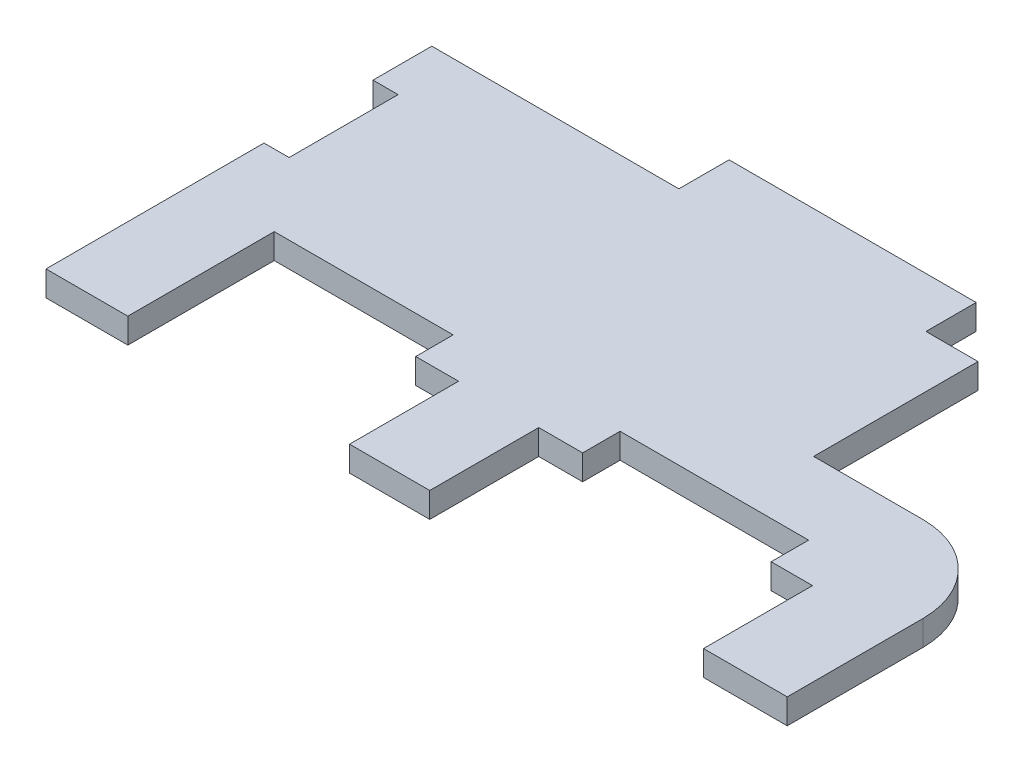
ISO-10303-21;
HEADER;
FILE_DESCRIPTION(('STEP AP214'),'2;1');
FILE_NAME('part.step','',(''),(''),'','','');
FILE_SCHEMA(('AUTOMOTIVE_DESIGN { 1 0 10303 214 1 1 1 1 }'));
ENDSEC;
DATA;
#1=APPLICATION_CONTEXT('core data for automotive mechanical design processes');
#2=APPLICATION_PROTOCOL_DEFINITION('international standard','automotive_design',2000,#1);
#3=PRODUCT_CONTEXT('',#1,'mechanical');
#4=PRODUCT('Part','Part','',(#3));
#5=PRODUCT_RELATED_PRODUCT_CATEGORY('part','',(#4));
#6=PRODUCT_DEFINITION_FORMATION('','',#4);
#7=PRODUCT_DEFINITION_CONTEXT('part definition',#1,'design');
#8=PRODUCT_DEFINITION('design','',#6,#7);
#9=PRODUCT_DEFINITION_SHAPE('','',#8);
#10=(LENGTH_UNIT() NAMED_UNIT(*) SI_UNIT(.MILLI.,.METRE.));
#11=(NAMED_UNIT(*) PLANE_ANGLE_UNIT() SI_UNIT($,.RADIAN.));
#12=(NAMED_UNIT(*) SI_UNIT($,.STERADIAN.) SOLID_ANGLE_UNIT());
#13=UNCERTAINTY_MEASURE_WITH_UNIT(LENGTH_MEASURE(1.E-05),#10,'distance_accuracy_value','');
#14=(GEOMETRIC_REPRESENTATION_CONTEXT(3) GLOBAL_UNCERTAINTY_ASSIGNED_CONTEXT((#13)) GLOBAL_UNIT_ASSIGNED_CONTEXT((#10,
#11,#12)) REPRESENTATION_CONTEXT('',''));
#15=CARTESIAN_POINT('',(0.,0.,0.));
#16=DIRECTION('',(0.,0.,1.));
#17=DIRECTION('',(1.,0.,0.));
#18=AXIS2_PLACEMENT_3D('',#15,#16,#17);
#19=CARTESIAN_POINT('',(-86.36,5.85,-38.1));
#20=DIRECTION('',(0.,0.,1.));
#21=DIRECTION('',(1.,0.,0.));
#22=AXIS2_PLACEMENT_3D('',#19,#20,#21);
#23=PLANE('',#22);
#24=DIRECTION('',(0.,1.,0.));
#25=VECTOR('',#24,1.);
#26=CARTESIAN_POINT('',(-28.7866666666667,5.84999999999999,-38.1));
#27=LINE('',#26,#25);
#28=CARTESIAN_POINT('',(-28.7866666666667,0.,-38.1));
#29=VERTEX_POINT('',#28);
#30=CARTESIAN_POINT('',(-28.7866666666667,5.84999999999999,-38.1));
#31=VERTEX_POINT('',#30);
#32=EDGE_CURVE('E232',#29,#31,#27,.T.);
#33=ORIENTED_EDGE('',*,*,#32,.T.);
#34=DIRECTION('',(-1.,0.,0.));
#35=VECTOR('',#34,1.);
#36=CARTESIAN_POINT('',(-86.36,5.85,-38.1));
#37=LINE('',#36,#35);
#38=CARTESIAN_POINT('',(28.7866666666666,5.84999999999999,-38.1));
#39=VERTEX_POINT('',#38);
#40=EDGE_CURVE('E247',#39,#31,#37,.T.);
#41=ORIENTED_EDGE('',*,*,#40,.F.);
#42=DIRECTION('',(0.,-1.,0.));
#43=VECTOR('',#42,1.);
#44=CARTESIAN_POINT('',(28.7866666666666,5.84999999999999,-38.1));
#45=LINE('',#44,#43);
#46=CARTESIAN_POINT('',(28.7866666666666,0.,-38.1));
#47=VERTEX_POINT('',#46);
#48=EDGE_CURVE('E798',#39,#47,#45,.T.);
#49=ORIENTED_EDGE('',*,*,#48,.T.);
#50=DIRECTION('',(-1.,0.,0.));
#51=VECTOR('',#50,1.);
#52=CARTESIAN_POINT('',(-86.36,0.,-38.1));
#53=LINE('',#52,#51);
#54=EDGE_CURVE('E383',#47,#29,#53,.T.);
#55=ORIENTED_EDGE('',*,*,#54,.T.);
#56=EDGE_LOOP('',(#33,#41,#49,#55));
#57=FACE_BOUND('',#56,.T.);
#58=ADVANCED_FACE('F33',(#57),#23,.F.);
#59=CARTESIAN_POINT('',(86.36,5.85,-38.1));
#60=DIRECTION('',(0.,-1.,0.));
#61=DIRECTION('',(0.,0.,-1.));
#62=AXIS2_PLACEMENT_3D('',#59,#60,#61);
#63=PLANE('',#62);
#64=DIRECTION('',(0.,0.,-1.));
#65=VECTOR('',#64,1.);
#66=CARTESIAN_POINT('',(86.36,5.85,38.1));
#67=LINE('',#66,#65);
#68=CARTESIAN_POINT('',(86.36,5.85,63.5));
#69=VERTEX_POINT('',#68);
#70=CARTESIAN_POINT('',(86.36,5.85,31.9));
#71=VERTEX_POINT('',#70);
#72=EDGE_CURVE('E373',#69,#71,#67,.T.);
#73=ORIENTED_EDGE('',*,*,#72,.T.);
#74=CARTESIAN_POINT('',(66.36,5.85,31.9));
#75=DIRECTION('',(0.,-1.,0.));
#76=DIRECTION('',(0.,0.,-1.));
#77=AXIS2_PLACEMENT_3D('',#74,#75,#76);
#78=CIRCLE('',#77,20.);
#79=CARTESIAN_POINT('',(66.36,5.85,11.9));
#80=VERTEX_POINT('',#79);
#81=EDGE_CURVE('E55',#71,#80,#78,.F.);
#82=ORIENTED_EDGE('',*,*,#81,.T.);
#83=DIRECTION('',(1.,0.,0.));
#84=VECTOR('',#83,1.);
#85=CARTESIAN_POINT('',(86.36,5.85,11.9));
#86=LINE('',#85,#84);
#87=CARTESIAN_POINT('',(40.9168751584446,5.85,11.9));
#88=VERTEX_POINT('',#87);
#89=EDGE_CURVE('E324',#88,#80,#86,.T.);
#90=ORIENTED_EDGE('',*,*,#89,.F.);
#91=DIRECTION('',(0.,0.,1.));
#92=VECTOR('',#91,1.);
#93=CARTESIAN_POINT('',(40.9168751584445,5.85,-38.1));
#94=LINE('',#93,#92);
#95=CARTESIAN_POINT('',(40.9168751584445,5.85,-26.4));
#96=VERTEX_POINT('',#95);
#97=EDGE_CURVE('E320',#96,#88,#94,.T.);
#98=ORIENTED_EDGE('',*,*,#97,.F.);
#99=DIRECTION('',(1.,0.,0.));
#100=VECTOR('',#99,1.);
#101=CARTESIAN_POINT('',(-86.36,5.85,-26.4));
#102=LINE('',#101,#100);
#103=CARTESIAN_POINT('',(28.7866666666666,5.85,-26.4));
#104=VERTEX_POINT('',#103);
#105=EDGE_CURVE('E241',#104,#96,#102,.T.);
#106=ORIENTED_EDGE('',*,*,#105,.F.);
#107=DIRECTION('',(0.,0.,1.));
#108=VECTOR('',#107,1.);
#109=CARTESIAN_POINT('',(28.7866666666666,5.84999999999999,-38.1));
#110=LINE('',#109,#108);
#111=EDGE_CURVE('E249',#39,#104,#110,.T.);
#112=ORIENTED_EDGE('',*,*,#111,.F.);
#113=ORIENTED_EDGE('',*,*,#40,.T.);
#114=DIRECTION('',(0.,0.,-1.));
#115=VECTOR('',#114,1.);
#116=CARTESIAN_POINT('',(-28.7866666666667,5.84999999999999,-38.1));
#117=LINE('',#116,#115);
#118=CARTESIAN_POINT('',(-28.7866666666667,5.85,-26.4));
#119=VERTEX_POINT('',#118);
#120=EDGE_CURVE('E226',#119,#31,#117,.T.);
#121=ORIENTED_EDGE('',*,*,#120,.F.);
#122=CARTESIAN_POINT('',(-86.36,5.85,-26.4));
#123=VERTEX_POINT('',#122);
#124=EDGE_CURVE('E236',#123,#119,#102,.T.);
#125=ORIENTED_EDGE('',*,*,#124,.F.);
#126=DIRECTION('',(0.,0.,1.));
#127=VECTOR('',#126,1.);
#128=CARTESIAN_POINT('',(-86.36,5.85,38.1));
#129=LINE('',#128,#127);
#130=CARTESIAN_POINT('',(-86.36,5.85,-12.7));
#131=VERTEX_POINT('',#130);
#132=EDGE_CURVE('E378',#123,#131,#129,.T.);
#133=ORIENTED_EDGE('',*,*,#132,.T.);
#134=DIRECTION('',(-1.,0.,0.));
#135=VECTOR('',#134,1.);
#136=CARTESIAN_POINT('',(-86.36,5.85,-12.7));
#137=LINE('',#136,#135);
#138=CARTESIAN_POINT('',(-80.51,5.85,-12.7));
#139=VERTEX_POINT('',#138);
#140=EDGE_CURVE('E360',#139,#131,#137,.T.);
#141=ORIENTED_EDGE('',*,*,#140,.F.);
#142=DIRECTION('',(0.,0.,-1.));
#143=VECTOR('',#142,1.);
#144=CARTESIAN_POINT('',(-80.51,5.85,-12.7));
#145=LINE('',#144,#143);
#146=CARTESIAN_POINT('',(-80.51,5.85,12.7));
#147=VERTEX_POINT('',#146);
#148=EDGE_CURVE('E357',#147,#139,#145,.T.);
#149=ORIENTED_EDGE('',*,*,#148,.F.);
#150=DIRECTION('',(1.,0.,0.));
#151=VECTOR('',#150,1.);
#152=CARTESIAN_POINT('',(-86.36,5.85,12.7));
#153=LINE('',#152,#151);
#154=CARTESIAN_POINT('',(-86.36,5.85,12.7));
#155=VERTEX_POINT('',#154);
#156=EDGE_CURVE('E352',#155,#147,#153,.T.);
#157=ORIENTED_EDGE('',*,*,#156,.F.);
#158=CARTESIAN_POINT('',(-86.36,5.85,63.5));
#159=VERTEX_POINT('',#158);
#160=EDGE_CURVE('E377',#155,#159,#129,.T.);
#161=ORIENTED_EDGE('',*,*,#160,.T.);
#162=DIRECTION('',(1.,0.,0.));
#163=VECTOR('',#162,1.);
#164=CARTESIAN_POINT('',(-86.36,5.85,63.5));
#165=LINE('',#164,#163);
#166=CARTESIAN_POINT('',(-67.2933113520948,5.85,63.5));
#167=VERTEX_POINT('',#166);
#168=EDGE_CURVE('E308',#159,#167,#165,.T.);
#169=ORIENTED_EDGE('',*,*,#168,.T.);
#170=DIRECTION('',(0.,0.,1.));
#171=VECTOR('',#170,1.);
#172=CARTESIAN_POINT('',(-67.2933113520948,5.85,38.1));
#173=LINE('',#172,#171);
#174=CARTESIAN_POINT('',(-67.2933113520948,5.85,29.3796161828272));
#175=VERTEX_POINT('',#174);
#176=EDGE_CURVE('E340',#175,#167,#173,.T.);
#177=ORIENTED_EDGE('',*,*,#176,.F.);
#178=DIRECTION('',(-1.,0.,0.));
#179=VECTOR('',#178,1.);
#180=CARTESIAN_POINT('',(-67.2933113520948,5.85,29.3796161828272));
#181=LINE('',#180,#179);
#182=CARTESIAN_POINT('',(-25.6022369593209,5.85,29.3796161828272));
#183=VERTEX_POINT('',#182);
#184=EDGE_CURVE('E346',#183,#175,#181,.T.);
#185=ORIENTED_EDGE('',*,*,#184,.F.);
#186=DIRECTION('',(0.,0.,-1.));
#187=VECTOR('',#186,1.);
#188=CARTESIAN_POINT('',(-25.6022369593209,5.85,38.1));
#189=LINE('',#188,#187);
#190=CARTESIAN_POINT('',(-25.6022369593209,5.85,38.1));
#191=VERTEX_POINT('',#190);
#192=EDGE_CURVE('E344',#191,#183,#189,.T.);
#193=ORIENTED_EDGE('',*,*,#192,.F.);
#194=DIRECTION('',(-1.,0.,0.));
#195=VECTOR('',#194,1.);
#196=CARTESIAN_POINT('',(-25.6022369593209,5.85,38.1));
#197=LINE('',#196,#195);
#198=CARTESIAN_POINT('',(-15.6247389259285,5.85,38.1));
#199=VERTEX_POINT('',#198);
#200=EDGE_CURVE('E286',#199,#191,#197,.T.);
#201=ORIENTED_EDGE('',*,*,#200,.F.);
#202=DIRECTION('',(0.,0.,-1.));
#203=VECTOR('',#202,1.);
#204=CARTESIAN_POINT('',(-15.6247389259285,5.85,38.1));
#205=LINE('',#204,#203);
#206=CARTESIAN_POINT('',(-15.6247389259285,5.85,63.5));
#207=VERTEX_POINT('',#206);
#208=EDGE_CURVE('E283',#207,#199,#205,.T.);
#209=ORIENTED_EDGE('',*,*,#208,.F.);
#210=DIRECTION('',(1.,0.,0.));
#211=VECTOR('',#210,1.);
#212=CARTESIAN_POINT('',(-25.6022369593209,5.85,63.5));
#213=LINE('',#212,#211);
#214=CARTESIAN_POINT('',(3.06081199953049,5.85,63.5));
#215=VERTEX_POINT('',#214);
#216=EDGE_CURVE('E304',#207,#215,#213,.T.);
#217=ORIENTED_EDGE('',*,*,#216,.T.);
#218=DIRECTION('',(0.,0.,1.));
#219=VECTOR('',#218,1.);
#220=CARTESIAN_POINT('',(3.06081199953049,5.85,38.1));
#221=LINE('',#220,#219);
#222=CARTESIAN_POINT('',(3.06081199953049,5.85,38.1));
#223=VERTEX_POINT('',#222);
#224=EDGE_CURVE('E273',#223,#215,#221,.T.);
#225=ORIENTED_EDGE('',*,*,#224,.F.);
#226=DIRECTION('',(-1.,0.,0.));
#227=VECTOR('',#226,1.);
#228=CARTESIAN_POINT('',(13.2907787493742,5.85,38.1));
#229=LINE('',#228,#227);
#230=CARTESIAN_POINT('',(13.2907787493742,5.85,38.1));
#231=VERTEX_POINT('',#230);
#232=EDGE_CURVE('E270',#231,#223,#229,.T.);
#233=ORIENTED_EDGE('',*,*,#232,.F.);
#234=DIRECTION('',(0.,0.,1.));
#235=VECTOR('',#234,1.);
#236=CARTESIAN_POINT('',(13.2907787493742,5.85,38.1));
#237=LINE('',#236,#235);
#238=CARTESIAN_POINT('',(13.2907787493742,5.85,29.3796161828272));
#239=VERTEX_POINT('',#238);
#240=EDGE_CURVE('E329',#239,#231,#237,.T.);
#241=ORIENTED_EDGE('',*,*,#240,.F.);
#242=DIRECTION('',(-1.,0.,0.));
#243=VECTOR('',#242,1.);
#244=CARTESIAN_POINT('',(13.2907787493742,5.85,29.3796161828272));
#245=LINE('',#244,#243);
#246=CARTESIAN_POINT('',(57.2203000894111,5.85,29.3796161828272));
#247=VERTEX_POINT('',#246);
#248=EDGE_CURVE('E334',#247,#239,#245,.T.);
#249=ORIENTED_EDGE('',*,*,#248,.F.);
#250=DIRECTION('',(0.,0.,-1.));
#251=VECTOR('',#250,1.);
#252=CARTESIAN_POINT('',(57.2203000894111,5.85,38.1));
#253=LINE('',#252,#251);
#254=CARTESIAN_POINT('',(57.2203000894111,5.85,38.1));
#255=VERTEX_POINT('',#254);
#256=EDGE_CURVE('E332',#255,#247,#253,.T.);
#257=ORIENTED_EDGE('',*,*,#256,.F.);
#258=DIRECTION('',(-1.,0.,0.));
#259=VECTOR('',#258,1.);
#260=CARTESIAN_POINT('',(57.2203000894111,5.85,38.1));
#261=LINE('',#260,#259);
#262=CARTESIAN_POINT('',(66.858290089925,5.85,38.1));
#263=VERTEX_POINT('',#262);
#264=EDGE_CURVE('E259',#263,#255,#261,.T.);
#265=ORIENTED_EDGE('',*,*,#264,.F.);
#266=DIRECTION('',(0.,0.,-1.));
#267=VECTOR('',#266,1.);
#268=CARTESIAN_POINT('',(66.858290089925,5.85,38.1));
#269=LINE('',#268,#267);
#270=CARTESIAN_POINT('',(66.858290089925,5.85,63.5));
#271=VERTEX_POINT('',#270);
#272=EDGE_CURVE('E256',#271,#263,#269,.T.);
#273=ORIENTED_EDGE('',*,*,#272,.F.);
#274=DIRECTION('',(1.,0.,0.));
#275=VECTOR('',#274,1.);
#276=CARTESIAN_POINT('',(57.2203000894111,5.85,63.5));
#277=LINE('',#276,#275);
#278=EDGE_CURVE('E297',#271,#69,#277,.T.);
#279=ORIENTED_EDGE('',*,*,#278,.T.);
#280=EDGE_LOOP('',(#73,#82,#90,#98,#106,#112,#113,#121,#125,#133,#141,#149,#157,#161,#169,#177,
#185,#193,#201,#209,#217,#225,#233,#241,#249,#257,#265,#273,#279));
#281=FACE_BOUND('',#280,.T.);
#282=ADVANCED_FACE('F244',(#281),#63,.F.);
#283=CARTESIAN_POINT('',(-86.36,5.85,38.1));
#284=DIRECTION('',(1.,0.,0.));
#285=DIRECTION('',(0.,0.,-1.));
#286=AXIS2_PLACEMENT_3D('',#283,#284,#285);
#287=PLANE('',#286);
#288=ORIENTED_EDGE('',*,*,#132,.F.);
#289=DIRECTION('',(0.,1.,0.));
#290=VECTOR('',#289,1.);
#291=CARTESIAN_POINT('',(-86.36,5.85,-26.4));
#292=LINE('',#291,#290);
#293=CARTESIAN_POINT('',(-86.36,0.,-26.4));
#294=VERTEX_POINT('',#293);
#295=EDGE_CURVE('E239',#294,#123,#292,.T.);
#296=ORIENTED_EDGE('',*,*,#295,.F.);
#297=DIRECTION('',(0.,0.,1.));
#298=VECTOR('',#297,1.);
#299=CARTESIAN_POINT('',(-86.36,0.,38.1));
#300=LINE('',#299,#298);
#301=CARTESIAN_POINT('',(-86.36,0.,-12.7));
#302=VERTEX_POINT('',#301);
#303=EDGE_CURVE('E375',#294,#302,#300,.T.);
#304=ORIENTED_EDGE('',*,*,#303,.T.);
#305=DIRECTION('',(0.,1.,0.));
#306=VECTOR('',#305,1.);
#307=CARTESIAN_POINT('',(-86.36,-4.15,-12.7));
#308=LINE('',#307,#306);
#309=EDGE_CURVE('E364',#302,#131,#308,.T.);
#310=ORIENTED_EDGE('',*,*,#309,.T.);
#311=EDGE_LOOP('',(#288,#296,#304,#310));
#312=FACE_BOUND('',#311,.T.);
#313=ADVANCED_FACE('F459',(#312),#287,.F.);
#314=CARTESIAN_POINT('',(86.36,5.85,38.1));
#315=DIRECTION('',(-1.,0.,0.));
#316=DIRECTION('',(0.,0.,1.));
#317=AXIS2_PLACEMENT_3D('',#314,#315,#316);
#318=PLANE('',#317);
#319=DIRECTION('',(0.,0.,-1.));
#320=VECTOR('',#319,1.);
#321=CARTESIAN_POINT('',(86.36,0.,38.1));
#322=LINE('',#321,#320);
#323=CARTESIAN_POINT('',(86.36,0.,63.5));
#324=VERTEX_POINT('',#323);
#325=CARTESIAN_POINT('',(86.36,0.,31.9));
#326=VERTEX_POINT('',#325);
#327=EDGE_CURVE('E367',#324,#326,#322,.T.);
#328=ORIENTED_EDGE('',*,*,#327,.T.);
#329=DIRECTION('',(0.,1.,0.));
#330=VECTOR('',#329,1.);
#331=CARTESIAN_POINT('',(86.36,5.85,31.9));
#332=LINE('',#331,#330);
#333=EDGE_CURVE('E424',#326,#71,#332,.T.);
#334=ORIENTED_EDGE('',*,*,#333,.T.);
#335=ORIENTED_EDGE('',*,*,#72,.F.);
#336=DIRECTION('',(0.,1.,0.));
#337=VECTOR('',#336,1.);
#338=CARTESIAN_POINT('',(86.36,0.,63.5));
#339=LINE('',#338,#337);
#340=EDGE_CURVE('E300',#324,#69,#339,.T.);
#341=ORIENTED_EDGE('',*,*,#340,.F.);
#342=EDGE_LOOP('',(#328,#334,#335,#341));
#343=FACE_BOUND('',#342,.T.);
#344=ADVANCED_FACE('F430',(#343),#318,.F.);
#345=ORIENTED_EDGE('',*,*,#160,.F.);
#346=DIRECTION('',(0.,1.,0.));
#347=VECTOR('',#346,1.);
#348=CARTESIAN_POINT('',(-86.36,-4.15,12.7));
#349=LINE('',#348,#347);
#350=CARTESIAN_POINT('',(-86.36,0.,12.7));
#351=VERTEX_POINT('',#350);
#352=EDGE_CURVE('E363',#351,#155,#349,.T.);
#353=ORIENTED_EDGE('',*,*,#352,.F.);
#354=CARTESIAN_POINT('',(-86.36,0.,63.5));
#355=VERTEX_POINT('',#354);
#356=EDGE_CURVE('E386',#351,#355,#300,.T.);
#357=ORIENTED_EDGE('',*,*,#356,.T.);
#358=DIRECTION('',(0.,1.,0.));
#359=VECTOR('',#358,1.);
#360=CARTESIAN_POINT('',(-86.36,0.,63.5));
#361=LINE('',#360,#359);
#362=EDGE_CURVE('E314',#355,#159,#361,.T.);
#363=ORIENTED_EDGE('',*,*,#362,.T.);
#364=EDGE_LOOP('',(#345,#353,#357,#363));
#365=FACE_BOUND('',#364,.T.);
#366=ADVANCED_FACE('F462',(#365),#287,.F.);
#367=CARTESIAN_POINT('',(86.36,0.,-38.1));
#368=DIRECTION('',(0.,-1.,0.));
#369=DIRECTION('',(0.,0.,-1.));
#370=AXIS2_PLACEMENT_3D('',#367,#368,#369);
#371=PLANE('',#370);
#372=DIRECTION('',(-1.,0.,0.));
#373=VECTOR('',#372,1.);
#374=CARTESIAN_POINT('',(86.36,0.,11.9));
#375=LINE('',#374,#373);
#376=CARTESIAN_POINT('',(66.36,0.,11.9));
#377=VERTEX_POINT('',#376);
#378=CARTESIAN_POINT('',(40.9168751584446,0.,11.9));
#379=VERTEX_POINT('',#378);
#380=EDGE_CURVE('E413',#377,#379,#375,.T.);
#381=ORIENTED_EDGE('',*,*,#380,.F.);
#382=CARTESIAN_POINT('',(66.36,0.,31.9));
#383=DIRECTION('',(0.,-1.,0.));
#384=DIRECTION('',(0.,0.,-1.));
#385=AXIS2_PLACEMENT_3D('',#382,#383,#384);
#386=CIRCLE('',#385,20.);
#387=EDGE_CURVE('E11',#377,#326,#386,.T.);
#388=ORIENTED_EDGE('',*,*,#387,.T.);
#389=ORIENTED_EDGE('',*,*,#327,.F.);
#390=DIRECTION('',(1.,0.,0.));
#391=VECTOR('',#390,1.);
#392=CARTESIAN_POINT('',(57.2203000894111,0.,63.5));
#393=LINE('',#392,#391);
#394=CARTESIAN_POINT('',(66.858290089925,0.,63.5));
#395=VERTEX_POINT('',#394);
#396=EDGE_CURVE('E298',#395,#324,#393,.T.);
#397=ORIENTED_EDGE('',*,*,#396,.F.);
#398=DIRECTION('',(0.,0.,1.));
#399=VECTOR('',#398,1.);
#400=CARTESIAN_POINT('',(66.858290089925,0.,-38.1));
#401=LINE('',#400,#399);
#402=CARTESIAN_POINT('',(66.858290089925,0.,38.1));
#403=VERTEX_POINT('',#402);
#404=EDGE_CURVE('E265',#403,#395,#401,.T.);
#405=ORIENTED_EDGE('',*,*,#404,.F.);
#406=DIRECTION('',(1.,0.,0.));
#407=VECTOR('',#406,1.);
#408=CARTESIAN_POINT('',(86.36,0.,38.1));
#409=LINE('',#408,#407);
#410=CARTESIAN_POINT('',(57.2203000894111,0.,38.1));
#411=VERTEX_POINT('',#410);
#412=EDGE_CURVE('E268',#411,#403,#409,.T.);
#413=ORIENTED_EDGE('',*,*,#412,.F.);
#414=DIRECTION('',(0.,0.,1.));
#415=VECTOR('',#414,1.);
#416=CARTESIAN_POINT('',(57.2203000894111,0.,-38.1));
#417=LINE('',#416,#415);
#418=CARTESIAN_POINT('',(57.2203000894111,0.,29.3796161828272));
#419=VERTEX_POINT('',#418);
#420=EDGE_CURVE('E402',#419,#411,#417,.T.);
#421=ORIENTED_EDGE('',*,*,#420,.F.);
#422=DIRECTION('',(1.,0.,0.));
#423=VECTOR('',#422,1.);
#424=CARTESIAN_POINT('',(86.36,0.,29.3796161828272));
#425=LINE('',#424,#423);
#426=CARTESIAN_POINT('',(13.2907787493742,0.,29.3796161828272));
#427=VERTEX_POINT('',#426);
#428=EDGE_CURVE('E405',#427,#419,#425,.T.);
#429=ORIENTED_EDGE('',*,*,#428,.F.);
#430=DIRECTION('',(0.,0.,-1.));
#431=VECTOR('',#430,1.);
#432=CARTESIAN_POINT('',(13.2907787493742,0.,-38.1));
#433=LINE('',#432,#431);
#434=CARTESIAN_POINT('',(13.2907787493742,0.,38.1));
#435=VERTEX_POINT('',#434);
#436=EDGE_CURVE('E408',#435,#427,#433,.T.);
#437=ORIENTED_EDGE('',*,*,#436,.F.);
#438=DIRECTION('',(1.,0.,0.));
#439=VECTOR('',#438,1.);
#440=CARTESIAN_POINT('',(86.36,0.,38.1));
#441=LINE('',#440,#439);
#442=CARTESIAN_POINT('',(3.06081199953049,0.,38.1));
#443=VERTEX_POINT('',#442);
#444=EDGE_CURVE('E281',#443,#435,#441,.T.);
#445=ORIENTED_EDGE('',*,*,#444,.F.);
#446=DIRECTION('',(0.,0.,-1.));
#447=VECTOR('',#446,1.);
#448=CARTESIAN_POINT('',(3.06081199953047,0.,-38.1));
#449=LINE('',#448,#447);
#450=CARTESIAN_POINT('',(3.06081199953049,0.,63.5));
#451=VERTEX_POINT('',#450);
#452=EDGE_CURVE('E278',#451,#443,#449,.T.);
#453=ORIENTED_EDGE('',*,*,#452,.F.);
#454=DIRECTION('',(1.,0.,0.));
#455=VECTOR('',#454,1.);
#456=CARTESIAN_POINT('',(-25.6022369593209,0.,63.5));
#457=LINE('',#456,#455);
#458=CARTESIAN_POINT('',(-15.6247389259285,0.,63.5));
#459=VERTEX_POINT('',#458);
#460=EDGE_CURVE('E305',#459,#451,#457,.T.);
#461=ORIENTED_EDGE('',*,*,#460,.F.);
#462=DIRECTION('',(0.,0.,1.));
#463=VECTOR('',#462,1.);
#464=CARTESIAN_POINT('',(-15.6247389259285,0.,-38.1));
#465=LINE('',#464,#463);
#466=CARTESIAN_POINT('',(-15.6247389259285,0.,38.1));
#467=VERTEX_POINT('',#466);
#468=EDGE_CURVE('E292',#467,#459,#465,.T.);
#469=ORIENTED_EDGE('',*,*,#468,.F.);
#470=DIRECTION('',(1.,0.,0.));
#471=VECTOR('',#470,1.);
#472=CARTESIAN_POINT('',(86.3600000000001,0.,38.0999999999999));
#473=LINE('',#472,#471);
#474=CARTESIAN_POINT('',(-25.6022369593209,0.,38.1));
#475=VERTEX_POINT('',#474);
#476=EDGE_CURVE('E295',#475,#467,#473,.T.);
#477=ORIENTED_EDGE('',*,*,#476,.F.);
#478=DIRECTION('',(0.,0.,1.));
#479=VECTOR('',#478,1.);
#480=CARTESIAN_POINT('',(-25.6022369593209,0.,-38.1));
#481=LINE('',#480,#479);
#482=CARTESIAN_POINT('',(-25.6022369593209,0.,29.3796161828272));
#483=VERTEX_POINT('',#482);
#484=EDGE_CURVE('E394',#483,#475,#481,.T.);
#485=ORIENTED_EDGE('',*,*,#484,.F.);
#486=DIRECTION('',(1.,0.,0.));
#487=VECTOR('',#486,1.);
#488=CARTESIAN_POINT('',(86.36,0.,29.3796161828272));
#489=LINE('',#488,#487);
#490=CARTESIAN_POINT('',(-67.2933113520948,0.,29.3796161828272));
#491=VERTEX_POINT('',#490);
#492=EDGE_CURVE('E397',#491,#483,#489,.T.);
#493=ORIENTED_EDGE('',*,*,#492,.F.);
#494=DIRECTION('',(0.,0.,-1.));
#495=VECTOR('',#494,1.);
#496=CARTESIAN_POINT('',(-67.2933113520948,0.,-38.1));
#497=LINE('',#496,#495);
#498=CARTESIAN_POINT('',(-67.2933113520948,0.,63.5));
#499=VERTEX_POINT('',#498);
#500=EDGE_CURVE('E400',#499,#491,#497,.T.);
#501=ORIENTED_EDGE('',*,*,#500,.F.);
#502=DIRECTION('',(1.,0.,0.));
#503=VECTOR('',#502,1.);
#504=CARTESIAN_POINT('',(-86.36,0.,63.5));
#505=LINE('',#504,#503);
#506=EDGE_CURVE('E311',#355,#499,#505,.T.);
#507=ORIENTED_EDGE('',*,*,#506,.F.);
#508=ORIENTED_EDGE('',*,*,#356,.F.);
#509=DIRECTION('',(-1.,0.,0.));
#510=VECTOR('',#509,1.);
#511=CARTESIAN_POINT('',(86.36,0.,12.7));
#512=LINE('',#511,#510);
#513=CARTESIAN_POINT('',(-80.51,0.,12.7));
#514=VERTEX_POINT('',#513);
#515=EDGE_CURVE('E380',#514,#351,#512,.T.);
#516=ORIENTED_EDGE('',*,*,#515,.F.);
#517=DIRECTION('',(0.,0.,1.));
#518=VECTOR('',#517,1.);
#519=CARTESIAN_POINT('',(-80.51,0.,-38.1));
#520=LINE('',#519,#518);
#521=CARTESIAN_POINT('',(-80.51,0.,-12.7));
#522=VERTEX_POINT('',#521);
#523=EDGE_CURVE('E389',#522,#514,#520,.T.);
#524=ORIENTED_EDGE('',*,*,#523,.F.);
#525=DIRECTION('',(1.,0.,0.));
#526=VECTOR('',#525,1.);
#527=CARTESIAN_POINT('',(86.36,0.,-12.7));
#528=LINE('',#527,#526);
#529=EDGE_CURVE('E392',#302,#522,#528,.T.);
#530=ORIENTED_EDGE('',*,*,#529,.F.);
#531=ORIENTED_EDGE('',*,*,#303,.F.);
#532=DIRECTION('',(-1.,0.,0.));
#533=VECTOR('',#532,1.);
#534=CARTESIAN_POINT('',(86.36,0.,-26.4));
#535=LINE('',#534,#533);
#536=CARTESIAN_POINT('',(-28.7866666666667,0.,-26.4));
#537=VERTEX_POINT('',#536);
#538=EDGE_CURVE('E251',#537,#294,#535,.T.);
#539=ORIENTED_EDGE('',*,*,#538,.F.);
#540=DIRECTION('',(0.,0.,-1.));
#541=VECTOR('',#540,1.);
#542=CARTESIAN_POINT('',(-28.7866666666667,0.,-28.1));
#543=LINE('',#542,#541);
#544=EDGE_CURVE('E229',#537,#29,#543,.T.);
#545=ORIENTED_EDGE('',*,*,#544,.T.);
#546=ORIENTED_EDGE('',*,*,#54,.F.);
#547=DIRECTION('',(0.,0.,-1.));
#548=VECTOR('',#547,1.);
#549=CARTESIAN_POINT('',(28.7866666666666,0.,-28.1));
#550=LINE('',#549,#548);
#551=CARTESIAN_POINT('',(28.7866666666666,0.,-26.4));
#552=VERTEX_POINT('',#551);
#553=EDGE_CURVE('E796',#552,#47,#550,.T.);
#554=ORIENTED_EDGE('',*,*,#553,.F.);
#555=CARTESIAN_POINT('',(40.9168751584445,0.,-26.4));
#556=VERTEX_POINT('',#555);
#557=EDGE_CURVE('E248',#556,#552,#535,.T.);
#558=ORIENTED_EDGE('',*,*,#557,.F.);
#559=DIRECTION('',(0.,0.,-1.));
#560=VECTOR('',#559,1.);
#561=CARTESIAN_POINT('',(40.9168751584445,0.,-38.1));
#562=LINE('',#561,#560);
#563=EDGE_CURVE('E410',#379,#556,#562,.T.);
#564=ORIENTED_EDGE('',*,*,#563,.F.);
#565=EDGE_LOOP('',(#381,#388,#389,#397,#405,#413,#421,#429,#437,#445,#453,#461,#469,#477,#485,
#493,#501,#507,#508,#516,#524,#530,#531,#539,#545,#546,#554,#558,#564));
#566=FACE_BOUND('',#565,.T.);
#567=ADVANCED_FACE('F444',(#566),#371,.T.);
#568=CARTESIAN_POINT('',(-86.36,-4.15,-12.7));
#569=DIRECTION('',(0.,0.,-1.));
#570=DIRECTION('',(-1.,0.,0.));
#571=AXIS2_PLACEMENT_3D('',#568,#569,#570);
#572=PLANE('',#571);
#573=ORIENTED_EDGE('',*,*,#529,.T.);
#574=DIRECTION('',(0.,1.,0.));
#575=VECTOR('',#574,1.);
#576=CARTESIAN_POINT('',(-80.51,-4.15,-12.7));
#577=LINE('',#576,#575);
#578=EDGE_CURVE('E368',#522,#139,#577,.T.);
#579=ORIENTED_EDGE('',*,*,#578,.T.);
#580=ORIENTED_EDGE('',*,*,#140,.T.);
#581=ORIENTED_EDGE('',*,*,#309,.F.);
#582=EDGE_LOOP('',(#573,#579,#580,#581));
#583=FACE_BOUND('',#582,.T.);
#584=ADVANCED_FACE('F478',(#583),#572,.F.);
#585=CARTESIAN_POINT('',(-80.51,-4.15,-12.7));
#586=DIRECTION('',(1.,0.,0.));
#587=DIRECTION('',(0.,0.,-1.));
#588=AXIS2_PLACEMENT_3D('',#585,#586,#587);
#589=PLANE('',#588);
#590=ORIENTED_EDGE('',*,*,#523,.T.);
#591=DIRECTION('',(0.,1.,0.));
#592=VECTOR('',#591,1.);
#593=CARTESIAN_POINT('',(-80.51,-4.15,12.7));
#594=LINE('',#593,#592);
#595=EDGE_CURVE('E370',#514,#147,#594,.T.);
#596=ORIENTED_EDGE('',*,*,#595,.T.);
#597=ORIENTED_EDGE('',*,*,#148,.T.);
#598=ORIENTED_EDGE('',*,*,#578,.F.);
#599=EDGE_LOOP('',(#590,#596,#597,#598));
#600=FACE_BOUND('',#599,.T.);
#601=ADVANCED_FACE('F483',(#600),#589,.F.);
#602=CARTESIAN_POINT('',(-86.36,-4.15,12.7));
#603=DIRECTION('',(0.,0.,1.));
#604=DIRECTION('',(1.,0.,0.));
#605=AXIS2_PLACEMENT_3D('',#602,#603,#604);
#606=PLANE('',#605);
#607=ORIENTED_EDGE('',*,*,#515,.T.);
#608=ORIENTED_EDGE('',*,*,#352,.T.);
#609=ORIENTED_EDGE('',*,*,#156,.T.);
#610=ORIENTED_EDGE('',*,*,#595,.F.);
#611=EDGE_LOOP('',(#607,#608,#609,#610));
#612=FACE_BOUND('',#611,.T.);
#613=ADVANCED_FACE('F595',(#612),#606,.F.);
#614=CARTESIAN_POINT('',(-67.2933113520948,-4.15,38.1));
#615=DIRECTION('',(-1.,0.,0.));
#616=DIRECTION('',(0.,0.,1.));
#617=AXIS2_PLACEMENT_3D('',#614,#615,#616);
#618=PLANE('',#617);
#619=ORIENTED_EDGE('',*,*,#500,.T.);
#620=DIRECTION('',(0.,1.,0.));
#621=VECTOR('',#620,1.);
#622=CARTESIAN_POINT('',(-67.2933113520948,-4.15,29.3796161828272));
#623=LINE('',#622,#621);
#624=EDGE_CURVE('E350',#491,#175,#623,.T.);
#625=ORIENTED_EDGE('',*,*,#624,.T.);
#626=ORIENTED_EDGE('',*,*,#176,.T.);
#627=DIRECTION('',(0.,1.,0.));
#628=VECTOR('',#627,1.);
#629=CARTESIAN_POINT('',(-67.2933113520948,0.,63.5));
#630=LINE('',#629,#628);
#631=EDGE_CURVE('E317',#499,#167,#630,.T.);
#632=ORIENTED_EDGE('',*,*,#631,.F.);
#633=EDGE_LOOP('',(#619,#625,#626,#632));
#634=FACE_BOUND('',#633,.T.);
#635=ADVANCED_FACE('F499',(#634),#618,.F.);
#636=CARTESIAN_POINT('',(-67.2933113520948,-4.15,29.3796161828272));
#637=DIRECTION('',(0.,0.,-1.));
#638=DIRECTION('',(-1.,0.,0.));
#639=AXIS2_PLACEMENT_3D('',#636,#637,#638);
#640=PLANE('',#639);
#641=ORIENTED_EDGE('',*,*,#492,.T.);
#642=DIRECTION('',(0.,1.,0.));
#643=VECTOR('',#642,1.);
#644=CARTESIAN_POINT('',(-25.6022369593209,-4.15,29.3796161828272));
#645=LINE('',#644,#643);
#646=EDGE_CURVE('E349',#483,#183,#645,.T.);
#647=ORIENTED_EDGE('',*,*,#646,.T.);
#648=ORIENTED_EDGE('',*,*,#184,.T.);
#649=ORIENTED_EDGE('',*,*,#624,.F.);
#650=EDGE_LOOP('',(#641,#647,#648,#649));
#651=FACE_BOUND('',#650,.T.);
#652=ADVANCED_FACE('F503',(#651),#640,.F.);
#653=CARTESIAN_POINT('',(-25.6022369593209,-4.15,38.1));
#654=DIRECTION('',(1.,0.,0.));
#655=DIRECTION('',(0.,0.,-1.));
#656=AXIS2_PLACEMENT_3D('',#653,#654,#655);
#657=PLANE('',#656);
#658=ORIENTED_EDGE('',*,*,#484,.T.);
#659=DIRECTION('',(0.,1.,0.));
#660=VECTOR('',#659,1.);
#661=CARTESIAN_POINT('',(-25.6022369593209,-4.15,38.1));
#662=LINE('',#661,#660);
#663=EDGE_CURVE('E289',#475,#191,#662,.T.);
#664=ORIENTED_EDGE('',*,*,#663,.T.);
#665=ORIENTED_EDGE('',*,*,#192,.T.);
#666=ORIENTED_EDGE('',*,*,#646,.F.);
#667=EDGE_LOOP('',(#658,#664,#665,#666));
#668=FACE_BOUND('',#667,.T.);
#669=ADVANCED_FACE('F506',(#668),#657,.F.);
#670=CARTESIAN_POINT('',(13.2907787493742,-4.15,38.1));
#671=DIRECTION('',(-1.,0.,0.));
#672=DIRECTION('',(0.,0.,1.));
#673=AXIS2_PLACEMENT_3D('',#670,#671,#672);
#674=PLANE('',#673);
#675=ORIENTED_EDGE('',*,*,#240,.T.);
#676=DIRECTION('',(0.,1.,0.));
#677=VECTOR('',#676,1.);
#678=CARTESIAN_POINT('',(13.2907787493742,-4.15,38.1));
#679=LINE('',#678,#677);
#680=EDGE_CURVE('E275',#435,#231,#679,.T.);
#681=ORIENTED_EDGE('',*,*,#680,.F.);
#682=ORIENTED_EDGE('',*,*,#436,.T.);
#683=DIRECTION('',(0.,1.,0.));
#684=VECTOR('',#683,1.);
#685=CARTESIAN_POINT('',(13.2907787493742,-4.15,29.3796161828272));
#686=LINE('',#685,#684);
#687=EDGE_CURVE('E338',#427,#239,#686,.T.);
#688=ORIENTED_EDGE('',*,*,#687,.T.);
#689=EDGE_LOOP('',(#675,#681,#682,#688));
#690=FACE_BOUND('',#689,.T.);
#691=ADVANCED_FACE('F536',(#690),#674,.F.);
#692=CARTESIAN_POINT('',(13.2907787493742,-4.15,29.3796161828272));
#693=DIRECTION('',(0.,0.,-1.));
#694=DIRECTION('',(-1.,0.,0.));
#695=AXIS2_PLACEMENT_3D('',#692,#693,#694);
#696=PLANE('',#695);
#697=ORIENTED_EDGE('',*,*,#428,.T.);
#698=DIRECTION('',(0.,1.,0.));
#699=VECTOR('',#698,1.);
#700=CARTESIAN_POINT('',(57.2203000894111,-4.15,29.3796161828272));
#701=LINE('',#700,#699);
#702=EDGE_CURVE('E337',#419,#247,#701,.T.);
#703=ORIENTED_EDGE('',*,*,#702,.T.);
#704=ORIENTED_EDGE('',*,*,#248,.T.);
#705=ORIENTED_EDGE('',*,*,#687,.F.);
#706=EDGE_LOOP('',(#697,#703,#704,#705));
#707=FACE_BOUND('',#706,.T.);
#708=ADVANCED_FACE('F540',(#707),#696,.F.);
#709=CARTESIAN_POINT('',(57.2203000894111,-4.15,38.1));
#710=DIRECTION('',(1.,0.,0.));
#711=DIRECTION('',(0.,0.,-1.));
#712=AXIS2_PLACEMENT_3D('',#709,#710,#711);
#713=PLANE('',#712);
#714=ORIENTED_EDGE('',*,*,#420,.T.);
#715=DIRECTION('',(0.,1.,0.));
#716=VECTOR('',#715,1.);
#717=CARTESIAN_POINT('',(57.2203000894111,-4.15,38.1));
#718=LINE('',#717,#716);
#719=EDGE_CURVE('E262',#411,#255,#718,.T.);
#720=ORIENTED_EDGE('',*,*,#719,.T.);
#721=ORIENTED_EDGE('',*,*,#256,.T.);
#722=ORIENTED_EDGE('',*,*,#702,.F.);
#723=EDGE_LOOP('',(#714,#720,#721,#722));
#724=FACE_BOUND('',#723,.T.);
#725=ADVANCED_FACE('F543',(#724),#713,.F.);
#726=CARTESIAN_POINT('',(86.36,-4.15,11.9));
#727=DIRECTION('',(0.,0.,1.));
#728=DIRECTION('',(1.,0.,0.));
#729=AXIS2_PLACEMENT_3D('',#726,#727,#728);
#730=PLANE('',#729);
#731=ORIENTED_EDGE('',*,*,#89,.T.);
#732=DIRECTION('',(0.,1.,0.));
#733=VECTOR('',#732,1.);
#734=CARTESIAN_POINT('',(66.36,-4.15,11.9));
#735=LINE('',#734,#733);
#736=EDGE_CURVE('E41',#80,#377,#735,.F.);
#737=ORIENTED_EDGE('',*,*,#736,.T.);
#738=ORIENTED_EDGE('',*,*,#380,.T.);
#739=DIRECTION('',(0.,1.,0.));
#740=VECTOR('',#739,1.);
#741=CARTESIAN_POINT('',(40.9168751584446,-4.15,11.9));
#742=LINE('',#741,#740);
#743=EDGE_CURVE('E326',#379,#88,#742,.T.);
#744=ORIENTED_EDGE('',*,*,#743,.T.);
#745=EDGE_LOOP('',(#731,#737,#738,#744));
#746=FACE_BOUND('',#745,.T.);
#747=ADVANCED_FACE('F577',(#746),#730,.F.);
#748=CARTESIAN_POINT('',(40.9168751584445,-4.15,-38.1));
#749=DIRECTION('',(-1.,0.,0.));
#750=DIRECTION('',(0.,0.,1.));
#751=AXIS2_PLACEMENT_3D('',#748,#749,#750);
#752=PLANE('',#751);
#753=ORIENTED_EDGE('',*,*,#563,.T.);
#754=DIRECTION('',(0.,1.,0.));
#755=VECTOR('',#754,1.);
#756=CARTESIAN_POINT('',(40.9168751584445,-4.15,-26.4));
#757=LINE('',#756,#755);
#758=EDGE_CURVE('E421',#556,#96,#757,.T.);
#759=ORIENTED_EDGE('',*,*,#758,.T.);
#760=ORIENTED_EDGE('',*,*,#97,.T.);
#761=ORIENTED_EDGE('',*,*,#743,.F.);
#762=EDGE_LOOP('',(#753,#759,#760,#761));
#763=FACE_BOUND('',#762,.T.);
#764=ADVANCED_FACE('F576',(#763),#752,.F.);
#765=CARTESIAN_POINT('',(-86.36,0.,63.5));
#766=DIRECTION('',(0.,0.,1.));
#767=DIRECTION('',(1.,0.,0.));
#768=AXIS2_PLACEMENT_3D('',#765,#766,#767);
#769=PLANE('',#768);
#770=ORIENTED_EDGE('',*,*,#168,.F.);
#771=ORIENTED_EDGE('',*,*,#362,.F.);
#772=ORIENTED_EDGE('',*,*,#506,.T.);
#773=ORIENTED_EDGE('',*,*,#631,.T.);
#774=EDGE_LOOP('',(#770,#771,#772,#773));
#775=FACE_BOUND('',#774,.T.);
#776=ADVANCED_FACE('F493',(#775),#769,.T.);
#777=CARTESIAN_POINT('',(-25.6022369593209,0.,63.5));
#778=DIRECTION('',(0.,0.,1.));
#779=DIRECTION('',(1.,0.,0.));
#780=AXIS2_PLACEMENT_3D('',#777,#778,#779);
#781=PLANE('',#780);
#782=DIRECTION('',(0.,-1.,0.));
#783=VECTOR('',#782,1.);
#784=CARTESIAN_POINT('',(3.0608119995305,0.,63.5));
#785=LINE('',#784,#783);
#786=EDGE_CURVE('E417',#215,#451,#785,.T.);
#787=ORIENTED_EDGE('',*,*,#786,.F.);
#788=ORIENTED_EDGE('',*,*,#216,.F.);
#789=DIRECTION('',(0.,1.,0.));
#790=VECTOR('',#789,1.);
#791=CARTESIAN_POINT('',(-15.6247389259285,0.,63.5));
#792=LINE('',#791,#790);
#793=EDGE_CURVE('E415',#459,#207,#792,.T.);
#794=ORIENTED_EDGE('',*,*,#793,.F.);
#795=ORIENTED_EDGE('',*,*,#460,.T.);
#796=EDGE_LOOP('',(#787,#788,#794,#795));
#797=FACE_BOUND('',#796,.T.);
#798=ADVANCED_FACE('F521',(#797),#781,.T.);
#799=CARTESIAN_POINT('',(57.2203000894111,0.,63.5));
#800=DIRECTION('',(0.,0.,1.));
#801=DIRECTION('',(1.,0.,0.));
#802=AXIS2_PLACEMENT_3D('',#799,#800,#801);
#803=PLANE('',#802);
#804=DIRECTION('',(0.,1.,0.));
#805=VECTOR('',#804,1.);
#806=CARTESIAN_POINT('',(66.858290089925,0.,63.5));
#807=LINE('',#806,#805);
#808=EDGE_CURVE('E419',#395,#271,#807,.T.);
#809=ORIENTED_EDGE('',*,*,#808,.F.);
#810=ORIENTED_EDGE('',*,*,#396,.T.);
#811=ORIENTED_EDGE('',*,*,#340,.T.);
#812=ORIENTED_EDGE('',*,*,#278,.F.);
#813=EDGE_LOOP('',(#809,#810,#811,#812));
#814=FACE_BOUND('',#813,.T.);
#815=ADVANCED_FACE('F440',(#814),#803,.T.);
#816=CARTESIAN_POINT('',(-25.6022369593209,-4.15,38.1));
#817=DIRECTION('',(0.,0.,-1.));
#818=DIRECTION('',(-1.,0.,0.));
#819=AXIS2_PLACEMENT_3D('',#816,#817,#818);
#820=PLANE('',#819);
#821=ORIENTED_EDGE('',*,*,#476,.T.);
#822=DIRECTION('',(0.,1.,0.));
#823=VECTOR('',#822,1.);
#824=CARTESIAN_POINT('',(-15.6247389259285,-4.15,38.1));
#825=LINE('',#824,#823);
#826=EDGE_CURVE('E288',#467,#199,#825,.T.);
#827=ORIENTED_EDGE('',*,*,#826,.T.);
#828=ORIENTED_EDGE('',*,*,#200,.T.);
#829=ORIENTED_EDGE('',*,*,#663,.F.);
#830=EDGE_LOOP('',(#821,#827,#828,#829));
#831=FACE_BOUND('',#830,.T.);
#832=ADVANCED_FACE('F511',(#831),#820,.F.);
#833=CARTESIAN_POINT('',(-15.6247389259285,-4.15,38.1));
#834=DIRECTION('',(1.,0.,0.));
#835=DIRECTION('',(0.,0.,-1.));
#836=AXIS2_PLACEMENT_3D('',#833,#834,#835);
#837=PLANE('',#836);
#838=ORIENTED_EDGE('',*,*,#468,.T.);
#839=ORIENTED_EDGE('',*,*,#793,.T.);
#840=ORIENTED_EDGE('',*,*,#208,.T.);
#841=ORIENTED_EDGE('',*,*,#826,.F.);
#842=EDGE_LOOP('',(#838,#839,#840,#841));
#843=FACE_BOUND('',#842,.T.);
#844=ADVANCED_FACE('F516',(#843),#837,.F.);
#845=CARTESIAN_POINT('',(3.06081199953049,-4.15,38.1));
#846=DIRECTION('',(-1.,0.,0.));
#847=DIRECTION('',(0.,0.,1.));
#848=AXIS2_PLACEMENT_3D('',#845,#846,#847);
#849=PLANE('',#848);
#850=ORIENTED_EDGE('',*,*,#452,.T.);
#851=DIRECTION('',(0.,1.,0.));
#852=VECTOR('',#851,1.);
#853=CARTESIAN_POINT('',(3.06081199953049,-4.15,38.1));
#854=LINE('',#853,#852);
#855=EDGE_CURVE('E276',#443,#223,#854,.T.);
#856=ORIENTED_EDGE('',*,*,#855,.T.);
#857=ORIENTED_EDGE('',*,*,#224,.T.);
#858=ORIENTED_EDGE('',*,*,#786,.T.);
#859=EDGE_LOOP('',(#850,#856,#857,#858));
#860=FACE_BOUND('',#859,.T.);
#861=ADVANCED_FACE('F527',(#860),#849,.F.);
#862=CARTESIAN_POINT('',(13.2907787493742,-4.15,38.1));
#863=DIRECTION('',(0.,0.,-1.));
#864=DIRECTION('',(-1.,0.,0.));
#865=AXIS2_PLACEMENT_3D('',#862,#863,#864);
#866=PLANE('',#865);
#867=ORIENTED_EDGE('',*,*,#444,.T.);
#868=ORIENTED_EDGE('',*,*,#680,.T.);
#869=ORIENTED_EDGE('',*,*,#232,.T.);
#870=ORIENTED_EDGE('',*,*,#855,.F.);
#871=EDGE_LOOP('',(#867,#868,#869,#870));
#872=FACE_BOUND('',#871,.T.);
#873=ADVANCED_FACE('F529',(#872),#866,.F.);
#874=CARTESIAN_POINT('',(57.2203000894111,-4.15,38.1));
#875=DIRECTION('',(0.,0.,-1.));
#876=DIRECTION('',(-1.,0.,0.));
#877=AXIS2_PLACEMENT_3D('',#874,#875,#876);
#878=PLANE('',#877);
#879=ORIENTED_EDGE('',*,*,#412,.T.);
#880=DIRECTION('',(0.,1.,0.));
#881=VECTOR('',#880,1.);
#882=CARTESIAN_POINT('',(66.858290089925,-4.15,38.1));
#883=LINE('',#882,#881);
#884=EDGE_CURVE('E261',#403,#263,#883,.T.);
#885=ORIENTED_EDGE('',*,*,#884,.T.);
#886=ORIENTED_EDGE('',*,*,#264,.T.);
#887=ORIENTED_EDGE('',*,*,#719,.F.);
#888=EDGE_LOOP('',(#879,#885,#886,#887));
#889=FACE_BOUND('',#888,.T.);
#890=ADVANCED_FACE('F547',(#889),#878,.F.);
#891=CARTESIAN_POINT('',(66.858290089925,-4.15,38.1));
#892=DIRECTION('',(1.,0.,0.));
#893=DIRECTION('',(0.,0.,-1.));
#894=AXIS2_PLACEMENT_3D('',#891,#892,#893);
#895=PLANE('',#894);
#896=ORIENTED_EDGE('',*,*,#404,.T.);
#897=ORIENTED_EDGE('',*,*,#808,.T.);
#898=ORIENTED_EDGE('',*,*,#272,.T.);
#899=ORIENTED_EDGE('',*,*,#884,.F.);
#900=EDGE_LOOP('',(#896,#897,#898,#899));
#901=FACE_BOUND('',#900,.T.);
#902=ADVANCED_FACE('F550',(#901),#895,.F.);
#903=CARTESIAN_POINT('',(86.36,-95.75,-26.4));
#904=DIRECTION('',(0.,0.,1.));
#905=DIRECTION('',(0.,-1.,0.));
#906=AXIS2_PLACEMENT_3D('',#903,#904,#905);
#907=PLANE('',#906);
#908=ORIENTED_EDGE('',*,*,#557,.T.);
#909=DIRECTION('',(0.,1.,0.));
#910=VECTOR('',#909,1.);
#911=CARTESIAN_POINT('',(28.7866666666669,-95.7500000000002,-26.4));
#912=LINE('',#911,#910);
#913=EDGE_CURVE('E233',#552,#104,#912,.T.);
#914=ORIENTED_EDGE('',*,*,#913,.T.);
#915=ORIENTED_EDGE('',*,*,#105,.T.);
#916=ORIENTED_EDGE('',*,*,#758,.F.);
#917=EDGE_LOOP('',(#908,#914,#915,#916));
#918=FACE_BOUND('',#917,.T.);
#919=ADVANCED_FACE('F551',(#918),#907,.F.);
#920=CARTESIAN_POINT('',(28.7866666666666,5.84999999999999,-28.1));
#921=DIRECTION('',(1.,0.,0.));
#922=DIRECTION('',(0.,-1.,0.));
#923=AXIS2_PLACEMENT_3D('',#920,#921,#922);
#924=PLANE('',#923);
#925=ORIENTED_EDGE('',*,*,#553,.T.);
#926=ORIENTED_EDGE('',*,*,#48,.F.);
#927=ORIENTED_EDGE('',*,*,#111,.T.);
#928=ORIENTED_EDGE('',*,*,#913,.F.);
#929=EDGE_LOOP('',(#925,#926,#927,#928));
#930=FACE_BOUND('',#929,.T.);
#931=ADVANCED_FACE('F557',(#930),#924,.T.);
#932=ORIENTED_EDGE('',*,*,#538,.T.);
#933=ORIENTED_EDGE('',*,*,#295,.T.);
#934=ORIENTED_EDGE('',*,*,#124,.T.);
#935=DIRECTION('',(0.,-1.,0.));
#936=VECTOR('',#935,1.);
#937=CARTESIAN_POINT('',(-28.7866666666665,-95.7500000000002,-26.4));
#938=LINE('',#937,#936);
#939=EDGE_CURVE('E222',#119,#537,#938,.T.);
#940=ORIENTED_EDGE('',*,*,#939,.T.);
#941=EDGE_LOOP('',(#932,#933,#934,#940));
#942=FACE_BOUND('',#941,.T.);
#943=ADVANCED_FACE('F237',(#942),#907,.F.);
#944=CARTESIAN_POINT('',(-28.7866666666667,5.84999999999999,-28.1));
#945=DIRECTION('',(-1.,0.,0.));
#946=DIRECTION('',(0.,1.,0.));
#947=AXIS2_PLACEMENT_3D('',#944,#945,#946);
#948=PLANE('',#947);
#949=ORIENTED_EDGE('',*,*,#120,.T.);
#950=ORIENTED_EDGE('',*,*,#32,.F.);
#951=ORIENTED_EDGE('',*,*,#544,.F.);
#952=ORIENTED_EDGE('',*,*,#939,.F.);
#953=EDGE_LOOP('',(#949,#950,#951,#952));
#954=FACE_BOUND('',#953,.T.);
#955=ADVANCED_FACE('F224',(#954),#948,.T.);
#956=CARTESIAN_POINT('',(66.36,5.85,31.9));
#957=DIRECTION('',(0.,1.,0.));
#958=DIRECTION('',(0.,0.,1.));
#959=AXIS2_PLACEMENT_3D('',#956,#957,#958);
#960=CYLINDRICAL_SURFACE('',#959,20.);
#961=ORIENTED_EDGE('',*,*,#387,.F.);
#962=ORIENTED_EDGE('',*,*,#736,.F.);
#963=ORIENTED_EDGE('',*,*,#81,.F.);
#964=ORIENTED_EDGE('',*,*,#333,.F.);
#965=EDGE_LOOP('',(#961,#962,#963,#964));
#966=FACE_BOUND('',#965,.T.);
#967=ADVANCED_FACE('F35',(#966),#960,.T.);
#968=CLOSED_SHELL('',(#58,#282,#313,#344,#366,#567,#584,#601,#613,#635,#652,#669,#691,#708,#725,
#747,#764,#776,#798,#815,#832,#844,#861,#873,#890,#902,#919,#931,#943,#955,#967));
#969=MANIFOLD_SOLID_BREP('B2',#968);
#970=ADVANCED_BREP_SHAPE_REPRESENTATION('',(#18,#969),#14);
#971=SHAPE_DEFINITION_REPRESENTATION(#9,#970);
ENDSEC;
END-ISO-10303-21;
